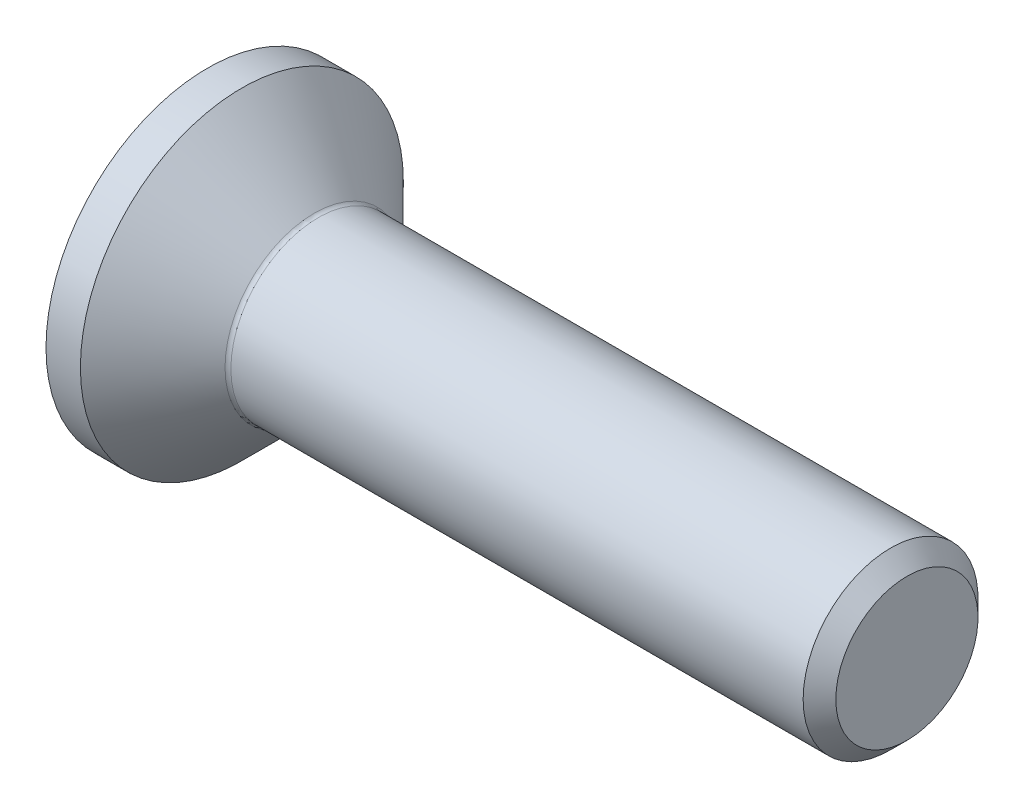
ISO-10303-21;
HEADER;
FILE_DESCRIPTION(('STEP AP214'),'2;1');
FILE_NAME('part.step','',(''),(''),'','','');
FILE_SCHEMA(('AUTOMOTIVE_DESIGN { 1 0 10303 214 1 1 1 1 }'));
ENDSEC;
DATA;
#1=APPLICATION_CONTEXT('core data for automotive mechanical design processes');
#2=APPLICATION_PROTOCOL_DEFINITION('international standard','automotive_design',2000,#1);
#3=PRODUCT_CONTEXT('',#1,'mechanical');
#4=PRODUCT('Part','Part','',(#3));
#5=PRODUCT_RELATED_PRODUCT_CATEGORY('part','',(#4));
#6=PRODUCT_DEFINITION_FORMATION('','',#4);
#7=PRODUCT_DEFINITION_CONTEXT('part definition',#1,'design');
#8=PRODUCT_DEFINITION('design','',#6,#7);
#9=PRODUCT_DEFINITION_SHAPE('','',#8);
#10=(LENGTH_UNIT() NAMED_UNIT(*) SI_UNIT(.MILLI.,.METRE.));
#11=(NAMED_UNIT(*) PLANE_ANGLE_UNIT() SI_UNIT($,.RADIAN.));
#12=(NAMED_UNIT(*) SI_UNIT($,.STERADIAN.) SOLID_ANGLE_UNIT());
#13=UNCERTAINTY_MEASURE_WITH_UNIT(LENGTH_MEASURE(1.E-05),#10,'distance_accuracy_value','');
#14=(GEOMETRIC_REPRESENTATION_CONTEXT(3) GLOBAL_UNCERTAINTY_ASSIGNED_CONTEXT((#13)) GLOBAL_UNIT_ASSIGNED_CONTEXT((#10,
#11,#12)) REPRESENTATION_CONTEXT('',''));
#15=CARTESIAN_POINT('',(0.,0.,0.));
#16=DIRECTION('',(0.,0.,1.));
#17=DIRECTION('',(1.,0.,0.));
#18=AXIS2_PLACEMENT_3D('',#15,#16,#17);
#19=CARTESIAN_POINT('',(0.,0.,0.));
#20=DIRECTION('',(-1.,0.,0.));
#21=DIRECTION('',(0.,0.,1.));
#22=AXIS2_PLACEMENT_3D('',#19,#20,#21);
#23=PLANE('',#22);
#24=CARTESIAN_POINT('',(0.,0.,0.));
#25=DIRECTION('',(-1.,0.,0.));
#26=DIRECTION('',(0.,0.,1.));
#27=AXIS2_PLACEMENT_3D('',#24,#25,#26);
#28=CIRCLE('',#27,2.77);
#29=CARTESIAN_POINT('',(0.,0.,2.77));
#30=VERTEX_POINT('',#29);
#31=EDGE_CURVE('E153',#30,#30,#28,.T.);
#32=ORIENTED_EDGE('',*,*,#31,.T.);
#33=EDGE_LOOP('',(#32));
#34=FACE_BOUND('',#33,.T.);
#35=DIRECTION('',(0.,-0.499999999999998,-0.86602540378444));
#36=VECTOR('',#35,1.);
#37=CARTESIAN_POINT('',(0.,-0.577350269189626,1.));
#38=LINE('',#37,#36);
#39=CARTESIAN_POINT('',(0.,-0.577350269189626,1.));
#40=VERTEX_POINT('',#39);
#41=CARTESIAN_POINT('',(0.,-1.15470053837925,0.));
#42=VERTEX_POINT('',#41);
#43=EDGE_CURVE('E119',#40,#42,#38,.T.);
#44=ORIENTED_EDGE('',*,*,#43,.T.);
#45=DIRECTION('',(0.,0.499999999999999,-0.866025403784439));
#46=VECTOR('',#45,1.);
#47=CARTESIAN_POINT('',(0.,-1.15470053837925,0.));
#48=LINE('',#47,#46);
#49=CARTESIAN_POINT('',(0.,-0.577350269189625,-1.));
#50=VERTEX_POINT('',#49);
#51=EDGE_CURVE('E50',#42,#50,#48,.T.);
#52=ORIENTED_EDGE('',*,*,#51,.T.);
#53=DIRECTION('',(0.,1.,0.));
#54=VECTOR('',#53,1.);
#55=CARTESIAN_POINT('',(0.,-0.577350269189625,-1.));
#56=LINE('',#55,#54);
#57=CARTESIAN_POINT('',(0.,0.577350269189626,-1.));
#58=VERTEX_POINT('',#57);
#59=EDGE_CURVE('E130',#50,#58,#56,.T.);
#60=ORIENTED_EDGE('',*,*,#59,.T.);
#61=DIRECTION('',(0.,0.5,0.866025403784439));
#62=VECTOR('',#61,1.);
#63=CARTESIAN_POINT('',(0.,0.577350269189626,-1.));
#64=LINE('',#63,#62);
#65=CARTESIAN_POINT('',(0.,1.15470053837925,0.));
#66=VERTEX_POINT('',#65);
#67=EDGE_CURVE('E254',#58,#66,#64,.T.);
#68=ORIENTED_EDGE('',*,*,#67,.T.);
#69=DIRECTION('',(0.,-0.499999999999999,0.866025403784439));
#70=VECTOR('',#69,1.);
#71=CARTESIAN_POINT('',(0.,1.15470053837925,0.));
#72=LINE('',#71,#70);
#73=CARTESIAN_POINT('',(0.,0.577350269189625,0.999999999999999));
#74=VERTEX_POINT('',#73);
#75=EDGE_CURVE('E257',#66,#74,#72,.T.);
#76=ORIENTED_EDGE('',*,*,#75,.T.);
#77=DIRECTION('',(0.,-1.,0.));
#78=VECTOR('',#77,1.);
#79=CARTESIAN_POINT('',(0.,0.577350269189625,0.999999999999999));
#80=LINE('',#79,#78);
#81=EDGE_CURVE('E260',#74,#40,#80,.T.);
#82=ORIENTED_EDGE('',*,*,#81,.T.);
#83=EDGE_LOOP('',(#44,#52,#60,#68,#76,#82));
#84=FACE_BOUND('',#83,.T.);
#85=ADVANCED_FACE('F35',(#34,#84),#23,.T.);
#86=CARTESIAN_POINT('',(0.,0.,0.));
#87=DIRECTION('',(-1.,0.,0.));
#88=DIRECTION('',(0.,0.,1.));
#89=AXIS2_PLACEMENT_3D('',#86,#87,#88);
#90=CYLINDRICAL_SURFACE('',#89,2.77);
#91=CARTESIAN_POINT('',(0.590000000000013,0.,0.));
#92=DIRECTION('',(-1.,0.,0.));
#93=DIRECTION('',(0.,0.,1.));
#94=AXIS2_PLACEMENT_3D('',#91,#92,#93);
#95=CIRCLE('',#94,2.77);
#96=CARTESIAN_POINT('',(0.590000000000013,0.,2.77));
#97=VERTEX_POINT('',#96);
#98=EDGE_CURVE('E150',#97,#97,#95,.T.);
#99=ORIENTED_EDGE('',*,*,#98,.T.);
#100=EDGE_LOOP('',(#99));
#101=FACE_BOUND('',#100,.T.);
#102=ORIENTED_EDGE('',*,*,#31,.F.);
#103=EDGE_LOOP('',(#102));
#104=FACE_BOUND('',#103,.T.);
#105=ADVANCED_FACE('F174',(#101,#104),#90,.T.);
#106=CARTESIAN_POINT('',(0.590000000000013,0.,0.));
#107=DIRECTION('',(-1.,0.,0.));
#108=DIRECTION('',(0.,0.,1.));
#109=AXIS2_PLACEMENT_3D('',#106,#107,#108);
#110=CONICAL_SURFACE('',#109,2.77,0.785398163397451);
#111=CARTESIAN_POINT('',(1.83071067811866,0.,0.));
#112=DIRECTION('',(-1.,0.,0.));
#113=DIRECTION('',(0.,0.,1.));
#114=AXIS2_PLACEMENT_3D('',#111,#112,#113);
#115=CIRCLE('',#114,1.52928932188135);
#116=CARTESIAN_POINT('',(1.83071067811866,0.,1.52928932188135));
#117=VERTEX_POINT('',#116);
#118=EDGE_CURVE('E43',#117,#117,#115,.T.);
#119=ORIENTED_EDGE('',*,*,#118,.T.);
#120=EDGE_LOOP('',(#119));
#121=FACE_BOUND('',#120,.T.);
#122=ORIENTED_EDGE('',*,*,#98,.F.);
#123=EDGE_LOOP('',(#122));
#124=FACE_BOUND('',#123,.T.);
#125=ADVANCED_FACE('F158',(#121,#124),#110,.T.);
#126=CARTESIAN_POINT('',(0.,0.,0.));
#127=DIRECTION('',(-1.,0.,0.));
#128=DIRECTION('',(0.,0.,1.));
#129=AXIS2_PLACEMENT_3D('',#126,#127,#128);
#130=CYLINDRICAL_SURFACE('',#129,1.5);
#131=CARTESIAN_POINT('',(1.90142135623731,0.,0.));
#132=DIRECTION('',(-1.,0.,0.));
#133=DIRECTION('',(0.,0.,1.));
#134=AXIS2_PLACEMENT_3D('',#131,#132,#133);
#135=CIRCLE('',#134,1.5);
#136=CARTESIAN_POINT('',(1.90142135623731,0.,1.5));
#137=VERTEX_POINT('',#136);
#138=EDGE_CURVE('E11',#137,#137,#135,.F.);
#139=ORIENTED_EDGE('',*,*,#138,.T.);
#140=EDGE_LOOP('',(#139));
#141=FACE_BOUND('',#140,.T.);
#142=CARTESIAN_POINT('',(11.7195,0.,0.));
#143=DIRECTION('',(-1.,0.,0.));
#144=DIRECTION('',(0.,0.,1.));
#145=AXIS2_PLACEMENT_3D('',#142,#143,#144);
#146=CIRCLE('',#145,1.5);
#147=CARTESIAN_POINT('',(11.7195,0.,1.5));
#148=VERTEX_POINT('',#147);
#149=EDGE_CURVE('E147',#148,#148,#146,.T.);
#150=ORIENTED_EDGE('',*,*,#149,.T.);
#151=EDGE_LOOP('',(#150));
#152=FACE_BOUND('',#151,.T.);
#153=ADVANCED_FACE('F185',(#141,#152),#130,.T.);
#154=CARTESIAN_POINT('',(12.,0.,0.));
#155=DIRECTION('',(-1.,0.,0.));
#156=DIRECTION('',(0.,0.,1.));
#157=AXIS2_PLACEMENT_3D('',#154,#155,#156);
#158=CONICAL_SURFACE('',#157,1.2195,0.785398163397448);
#159=ORIENTED_EDGE('',*,*,#149,.F.);
#160=EDGE_LOOP('',(#159));
#161=FACE_BOUND('',#160,.T.);
#162=CARTESIAN_POINT('',(12.,0.,0.));
#163=DIRECTION('',(-1.,0.,0.));
#164=DIRECTION('',(0.,0.,1.));
#165=AXIS2_PLACEMENT_3D('',#162,#163,#164);
#166=CIRCLE('',#165,1.2195);
#167=CARTESIAN_POINT('',(12.,0.,1.2195));
#168=VERTEX_POINT('',#167);
#169=EDGE_CURVE('E143',#168,#168,#166,.T.);
#170=ORIENTED_EDGE('',*,*,#169,.T.);
#171=EDGE_LOOP('',(#170));
#172=FACE_BOUND('',#171,.T.);
#173=ADVANCED_FACE('F169',(#161,#172),#158,.T.);
#174=CARTESIAN_POINT('',(12.,1.2195,0.));
#175=DIRECTION('',(1.,0.,0.));
#176=DIRECTION('',(0.,0.,-1.));
#177=AXIS2_PLACEMENT_3D('',#174,#175,#176);
#178=PLANE('',#177);
#179=ORIENTED_EDGE('',*,*,#169,.F.);
#180=EDGE_LOOP('',(#179));
#181=FACE_BOUND('',#180,.T.);
#182=ADVANCED_FACE('F162',(#181),#178,.T.);
#183=CARTESIAN_POINT('',(1.90142135623731,0.,0.));
#184=DIRECTION('',(-1.,0.,0.));
#185=DIRECTION('',(0.,0.,1.));
#186=AXIS2_PLACEMENT_3D('',#183,#184,#185);
#187=TOROIDAL_SURFACE('',#186,1.6,0.1);
#188=ORIENTED_EDGE('',*,*,#138,.F.);
#189=EDGE_LOOP('',(#188));
#190=FACE_BOUND('',#189,.T.);
#191=ORIENTED_EDGE('',*,*,#118,.F.);
#192=EDGE_LOOP('',(#191));
#193=FACE_BOUND('',#192,.T.);
#194=ADVANCED_FACE('F37',(#190,#193),#187,.F.);
#195=CARTESIAN_POINT('',(1.1,-1.15470053837925,0.));
#196=DIRECTION('',(0.,0.866025403784439,0.499999999999999));
#197=DIRECTION('',(0.,-0.499999999999999,0.866025403784439));
#198=AXIS2_PLACEMENT_3D('',#195,#196,#197);
#199=PLANE('',#198);
#200=ORIENTED_EDGE('',*,*,#51,.F.);
#201=DIRECTION('',(-1.,0.,0.));
#202=VECTOR('',#201,1.);
#203=CARTESIAN_POINT('',(1.1,-1.15470053837925,0.));
#204=LINE('',#203,#202);
#205=CARTESIAN_POINT('',(1.1,-1.15470053837925,0.));
#206=VERTEX_POINT('',#205);
#207=EDGE_CURVE('E251',#206,#42,#204,.T.);
#208=ORIENTED_EDGE('',*,*,#207,.F.);
#209=DIRECTION('',(0.,0.499999999999999,-0.866025403784439));
#210=VECTOR('',#209,1.);
#211=CARTESIAN_POINT('',(1.1,-1.15470053837925,0.));
#212=LINE('',#211,#210);
#213=CARTESIAN_POINT('',(1.1,-0.866025403784438,-0.499999999999998));
#214=VERTEX_POINT('',#213);
#215=EDGE_CURVE('E115',#206,#214,#212,.T.);
#216=ORIENTED_EDGE('',*,*,#215,.T.);
#217=CARTESIAN_POINT('',(1.1,-0.577350269189625,-1.));
#218=VERTEX_POINT('',#217);
#219=EDGE_CURVE('E111',#214,#218,#212,.T.);
#220=ORIENTED_EDGE('',*,*,#219,.T.);
#221=DIRECTION('',(-1.,0.,0.));
#222=VECTOR('',#221,1.);
#223=CARTESIAN_POINT('',(1.1,-0.577350269189625,-1.));
#224=LINE('',#223,#222);
#225=EDGE_CURVE('E113',#218,#50,#224,.T.);
#226=ORIENTED_EDGE('',*,*,#225,.T.);
#227=EDGE_LOOP('',(#200,#208,#216,#220,#226));
#228=FACE_BOUND('',#227,.T.);
#229=ADVANCED_FACE('F112',(#228),#199,.T.);
#230=CARTESIAN_POINT('',(1.1,-0.577350269189625,-1.));
#231=DIRECTION('',(0.,0.,1.));
#232=DIRECTION('',(1.,0.,0.));
#233=AXIS2_PLACEMENT_3D('',#230,#231,#232);
#234=PLANE('',#233);
#235=ORIENTED_EDGE('',*,*,#59,.F.);
#236=ORIENTED_EDGE('',*,*,#225,.F.);
#237=DIRECTION('',(0.,1.,0.));
#238=VECTOR('',#237,1.);
#239=CARTESIAN_POINT('',(1.1,-0.577350269189625,-1.));
#240=LINE('',#239,#238);
#241=CARTESIAN_POINT('',(1.1,0.,-1.));
#242=VERTEX_POINT('',#241);
#243=EDGE_CURVE('E58',#218,#242,#240,.T.);
#244=ORIENTED_EDGE('',*,*,#243,.T.);
#245=CARTESIAN_POINT('',(1.1,0.577350269189626,-1.));
#246=VERTEX_POINT('',#245);
#247=EDGE_CURVE('E125',#242,#246,#240,.T.);
#248=ORIENTED_EDGE('',*,*,#247,.T.);
#249=DIRECTION('',(-1.,0.,0.));
#250=VECTOR('',#249,1.);
#251=CARTESIAN_POINT('',(1.1,0.577350269189626,-1.));
#252=LINE('',#251,#250);
#253=EDGE_CURVE('E132',#246,#58,#252,.T.);
#254=ORIENTED_EDGE('',*,*,#253,.T.);
#255=EDGE_LOOP('',(#235,#236,#244,#248,#254));
#256=FACE_BOUND('',#255,.T.);
#257=ADVANCED_FACE('F127',(#256),#234,.T.);
#258=CARTESIAN_POINT('',(1.1,0.577350269189626,-1.));
#259=DIRECTION('',(0.,-0.866025403784438,0.5));
#260=DIRECTION('',(0.,-0.5,-0.866025403784439));
#261=AXIS2_PLACEMENT_3D('',#258,#259,#260);
#262=PLANE('',#261);
#263=ORIENTED_EDGE('',*,*,#67,.F.);
#264=ORIENTED_EDGE('',*,*,#253,.F.);
#265=DIRECTION('',(0.,0.5,0.866025403784439));
#266=VECTOR('',#265,1.);
#267=CARTESIAN_POINT('',(1.1,0.577350269189626,-1.));
#268=LINE('',#267,#266);
#269=CARTESIAN_POINT('',(1.1,0.866025403784439,-0.5));
#270=VERTEX_POINT('',#269);
#271=EDGE_CURVE('E232',#246,#270,#268,.T.);
#272=ORIENTED_EDGE('',*,*,#271,.T.);
#273=CARTESIAN_POINT('',(1.1,1.15470053837925,0.));
#274=VERTEX_POINT('',#273);
#275=EDGE_CURVE('E124',#270,#274,#268,.T.);
#276=ORIENTED_EDGE('',*,*,#275,.T.);
#277=DIRECTION('',(-1.,0.,0.));
#278=VECTOR('',#277,1.);
#279=CARTESIAN_POINT('',(1.1,1.15470053837925,0.));
#280=LINE('',#279,#278);
#281=EDGE_CURVE('E138',#274,#66,#280,.T.);
#282=ORIENTED_EDGE('',*,*,#281,.T.);
#283=EDGE_LOOP('',(#263,#264,#272,#276,#282));
#284=FACE_BOUND('',#283,.T.);
#285=ADVANCED_FACE('F199',(#284),#262,.T.);
#286=CARTESIAN_POINT('',(1.1,1.15470053837925,0.));
#287=DIRECTION('',(0.,-0.866025403784439,-0.499999999999999));
#288=DIRECTION('',(0.,0.499999999999999,-0.866025403784439));
#289=AXIS2_PLACEMENT_3D('',#286,#287,#288);
#290=PLANE('',#289);
#291=ORIENTED_EDGE('',*,*,#75,.F.);
#292=ORIENTED_EDGE('',*,*,#281,.F.);
#293=DIRECTION('',(0.,-0.499999999999999,0.866025403784439));
#294=VECTOR('',#293,1.);
#295=CARTESIAN_POINT('',(1.1,1.15470053837925,0.));
#296=LINE('',#295,#294);
#297=CARTESIAN_POINT('',(1.1,0.866025403784438,0.499999999999999));
#298=VERTEX_POINT('',#297);
#299=EDGE_CURVE('E239',#274,#298,#296,.T.);
#300=ORIENTED_EDGE('',*,*,#299,.T.);
#301=CARTESIAN_POINT('',(1.1,0.577350269189625,0.999999999999999));
#302=VERTEX_POINT('',#301);
#303=EDGE_CURVE('E237',#298,#302,#296,.T.);
#304=ORIENTED_EDGE('',*,*,#303,.T.);
#305=DIRECTION('',(-1.,0.,0.));
#306=VECTOR('',#305,1.);
#307=CARTESIAN_POINT('',(1.1,0.577350269189625,0.999999999999999));
#308=LINE('',#307,#306);
#309=EDGE_CURVE('E269',#302,#74,#308,.T.);
#310=ORIENTED_EDGE('',*,*,#309,.T.);
#311=EDGE_LOOP('',(#291,#292,#300,#304,#310));
#312=FACE_BOUND('',#311,.T.);
#313=ADVANCED_FACE('F202',(#312),#290,.T.);
#314=CARTESIAN_POINT('',(1.1,0.577350269189625,0.999999999999999));
#315=DIRECTION('',(0.,0.,-1.));
#316=DIRECTION('',(0.,1.,0.));
#317=AXIS2_PLACEMENT_3D('',#314,#315,#316);
#318=PLANE('',#317);
#319=ORIENTED_EDGE('',*,*,#81,.F.);
#320=ORIENTED_EDGE('',*,*,#309,.F.);
#321=DIRECTION('',(0.,-1.,0.));
#322=VECTOR('',#321,1.);
#323=CARTESIAN_POINT('',(1.1,0.577350269189625,0.999999999999999));
#324=LINE('',#323,#322);
#325=CARTESIAN_POINT('',(1.1,0.,1.));
#326=VERTEX_POINT('',#325);
#327=EDGE_CURVE('E244',#302,#326,#324,.T.);
#328=ORIENTED_EDGE('',*,*,#327,.T.);
#329=CARTESIAN_POINT('',(1.1,-0.577350269189626,1.));
#330=VERTEX_POINT('',#329);
#331=EDGE_CURVE('E243',#326,#330,#324,.T.);
#332=ORIENTED_EDGE('',*,*,#331,.T.);
#333=DIRECTION('',(-1.,0.,0.));
#334=VECTOR('',#333,1.);
#335=CARTESIAN_POINT('',(1.1,-0.577350269189626,1.));
#336=LINE('',#335,#334);
#337=EDGE_CURVE('E266',#330,#40,#336,.T.);
#338=ORIENTED_EDGE('',*,*,#337,.T.);
#339=EDGE_LOOP('',(#319,#320,#328,#332,#338));
#340=FACE_BOUND('',#339,.T.);
#341=ADVANCED_FACE('F206',(#340),#318,.T.);
#342=CARTESIAN_POINT('',(1.1,-0.577350269189626,1.));
#343=DIRECTION('',(0.,0.86602540378444,-0.499999999999998));
#344=DIRECTION('',(0.,0.499999999999998,0.86602540378444));
#345=AXIS2_PLACEMENT_3D('',#342,#343,#344);
#346=PLANE('',#345);
#347=ORIENTED_EDGE('',*,*,#43,.F.);
#348=ORIENTED_EDGE('',*,*,#337,.F.);
#349=DIRECTION('',(0.,-0.499999999999998,-0.86602540378444));
#350=VECTOR('',#349,1.);
#351=CARTESIAN_POINT('',(1.1,-0.577350269189626,1.));
#352=LINE('',#351,#350);
#353=CARTESIAN_POINT('',(1.1,-0.866025403784439,0.499999999999997));
#354=VERTEX_POINT('',#353);
#355=EDGE_CURVE('E248',#330,#354,#352,.T.);
#356=ORIENTED_EDGE('',*,*,#355,.T.);
#357=EDGE_CURVE('E247',#354,#206,#352,.T.);
#358=ORIENTED_EDGE('',*,*,#357,.T.);
#359=ORIENTED_EDGE('',*,*,#207,.T.);
#360=EDGE_LOOP('',(#347,#348,#356,#358,#359));
#361=FACE_BOUND('',#360,.T.);
#362=ADVANCED_FACE('F210',(#361),#346,.T.);
#363=CARTESIAN_POINT('',(1.1,-0.577350269189626,-1.));
#364=DIRECTION('',(1.,0.,0.));
#365=DIRECTION('',(0.,0.,-1.));
#366=AXIS2_PLACEMENT_3D('',#363,#364,#365);
#367=PLANE('',#366);
#368=ORIENTED_EDGE('',*,*,#243,.F.);
#369=ORIENTED_EDGE('',*,*,#219,.F.);
#370=CARTESIAN_POINT('',(1.1,0.,0.));
#371=DIRECTION('',(-1.,0.,0.));
#372=DIRECTION('',(0.,0.,1.));
#373=AXIS2_PLACEMENT_3D('',#370,#371,#372);
#374=CIRCLE('',#373,1.);
#375=EDGE_CURVE('E122',#242,#214,#374,.T.);
#376=ORIENTED_EDGE('',*,*,#375,.F.);
#377=EDGE_LOOP('',(#368,#369,#376));
#378=FACE_BOUND('',#377,.T.);
#379=ADVANCED_FACE('F121',(#378),#367,.F.);
#380=ORIENTED_EDGE('',*,*,#215,.F.);
#381=ORIENTED_EDGE('',*,*,#357,.F.);
#382=EDGE_CURVE('E135',#214,#354,#374,.T.);
#383=ORIENTED_EDGE('',*,*,#382,.F.);
#384=EDGE_LOOP('',(#380,#381,#383));
#385=FACE_BOUND('',#384,.T.);
#386=ADVANCED_FACE('F216',(#385),#367,.F.);
#387=ORIENTED_EDGE('',*,*,#355,.F.);
#388=ORIENTED_EDGE('',*,*,#331,.F.);
#389=EDGE_CURVE('E131',#354,#326,#374,.T.);
#390=ORIENTED_EDGE('',*,*,#389,.F.);
#391=EDGE_LOOP('',(#387,#388,#390));
#392=FACE_BOUND('',#391,.T.);
#393=ADVANCED_FACE('F220',(#392),#367,.F.);
#394=ORIENTED_EDGE('',*,*,#327,.F.);
#395=ORIENTED_EDGE('',*,*,#303,.F.);
#396=EDGE_CURVE('E137',#326,#298,#374,.T.);
#397=ORIENTED_EDGE('',*,*,#396,.F.);
#398=EDGE_LOOP('',(#394,#395,#397));
#399=FACE_BOUND('',#398,.T.);
#400=ADVANCED_FACE('F228',(#399),#367,.F.);
#401=ORIENTED_EDGE('',*,*,#299,.F.);
#402=ORIENTED_EDGE('',*,*,#275,.F.);
#403=EDGE_CURVE('E144',#298,#270,#374,.T.);
#404=ORIENTED_EDGE('',*,*,#403,.F.);
#405=EDGE_LOOP('',(#401,#402,#404));
#406=FACE_BOUND('',#405,.T.);
#407=ADVANCED_FACE('F223',(#406),#367,.F.);
#408=ORIENTED_EDGE('',*,*,#271,.F.);
#409=ORIENTED_EDGE('',*,*,#247,.F.);
#410=EDGE_CURVE('E233',#270,#242,#374,.T.);
#411=ORIENTED_EDGE('',*,*,#410,.F.);
#412=EDGE_LOOP('',(#408,#409,#411));
#413=FACE_BOUND('',#412,.T.);
#414=ADVANCED_FACE('F194',(#413),#367,.F.);
#415=CARTESIAN_POINT('',(1.1,0.,0.));
#416=DIRECTION('',(-1.,0.,0.));
#417=DIRECTION('',(0.,0.,1.));
#418=AXIS2_PLACEMENT_3D('',#415,#416,#417);
#419=CONICAL_SURFACE('',#418,1.,1.04719755119659);
#420=CARTESIAN_POINT('',(1.67735026918963,0.,0.));
#421=VERTEX_POINT('',#420);
#422=VERTEX_LOOP('',#421);
#423=FACE_BOUND('',#422,.T.);
#424=ORIENTED_EDGE('',*,*,#396,.T.);
#425=ORIENTED_EDGE('',*,*,#403,.T.);
#426=ORIENTED_EDGE('',*,*,#410,.T.);
#427=ORIENTED_EDGE('',*,*,#375,.T.);
#428=ORIENTED_EDGE('',*,*,#382,.T.);
#429=ORIENTED_EDGE('',*,*,#389,.T.);
#430=EDGE_LOOP('',(#424,#425,#426,#427,#428,#429));
#431=FACE_BOUND('',#430,.T.);
#432=ADVANCED_FACE('F192',(#423,#431),#419,.F.);
#433=CLOSED_SHELL('',(#85,#105,#125,#153,#173,#182,#194,#229,#257,#285,#313,#341,#362,#379,#386,
#393,#400,#407,#414,#432));
#434=MANIFOLD_SOLID_BREP('B2',#433);
#435=ADVANCED_BREP_SHAPE_REPRESENTATION('',(#18,#434),#14);
#436=SHAPE_DEFINITION_REPRESENTATION(#9,#435);
ENDSEC;
END-ISO-10303-21;
